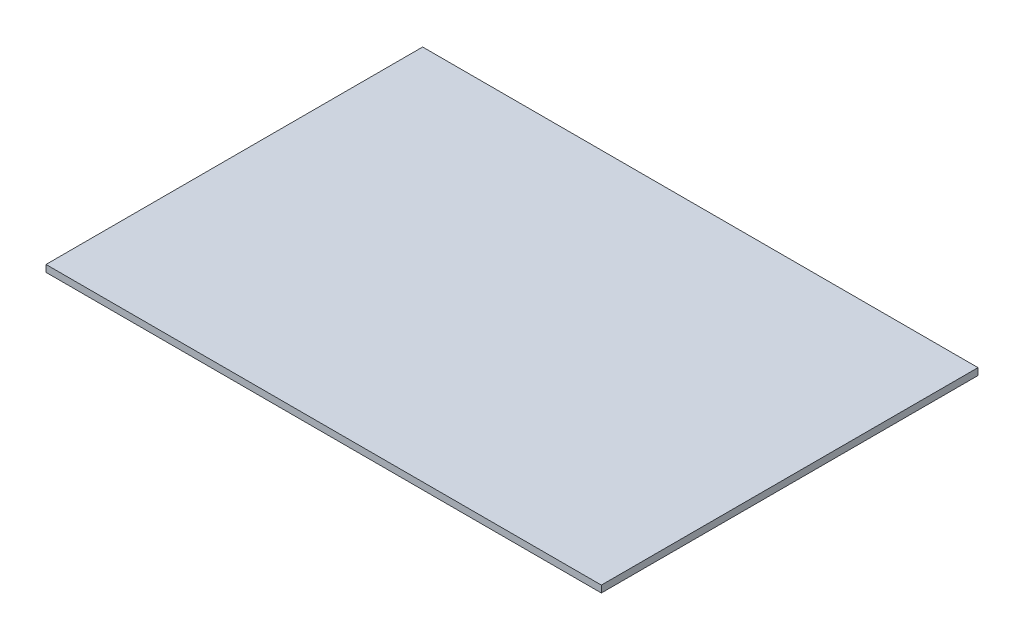
ISO-10303-21;
HEADER;
FILE_DESCRIPTION(('STEP AP214'),'2;1');
FILE_NAME('part.step','',(''),(''),'','','');
FILE_SCHEMA(('AUTOMOTIVE_DESIGN { 1 0 10303 214 1 1 1 1 }'));
ENDSEC;
DATA;
#1=APPLICATION_CONTEXT('core data for automotive mechanical design processes');
#2=APPLICATION_PROTOCOL_DEFINITION('international standard','automotive_design',2000,#1);
#3=PRODUCT_CONTEXT('',#1,'mechanical');
#4=PRODUCT('Part','Part','',(#3));
#5=PRODUCT_RELATED_PRODUCT_CATEGORY('part','',(#4));
#6=PRODUCT_DEFINITION_FORMATION('','',#4);
#7=PRODUCT_DEFINITION_CONTEXT('part definition',#1,'design');
#8=PRODUCT_DEFINITION('design','',#6,#7);
#9=PRODUCT_DEFINITION_SHAPE('','',#8);
#10=(LENGTH_UNIT() NAMED_UNIT(*) SI_UNIT(.MILLI.,.METRE.));
#11=(NAMED_UNIT(*) PLANE_ANGLE_UNIT() SI_UNIT($,.RADIAN.));
#12=(NAMED_UNIT(*) SI_UNIT($,.STERADIAN.) SOLID_ANGLE_UNIT());
#13=UNCERTAINTY_MEASURE_WITH_UNIT(LENGTH_MEASURE(1.E-05),#10,'distance_accuracy_value','');
#14=(GEOMETRIC_REPRESENTATION_CONTEXT(3) GLOBAL_UNCERTAINTY_ASSIGNED_CONTEXT((#13)) GLOBAL_UNIT_ASSIGNED_CONTEXT((#10,
#11,#12)) REPRESENTATION_CONTEXT('',''));
#15=CARTESIAN_POINT('',(0.,0.,0.));
#16=DIRECTION('',(0.,0.,1.));
#17=DIRECTION('',(1.,0.,0.));
#18=AXIS2_PLACEMENT_3D('',#15,#16,#17);
#19=CARTESIAN_POINT('',(102.580798220228,2.54,69.5721255256004));
#20=DIRECTION('',(-1.,0.,0.));
#21=DIRECTION('',(0.,0.,1.));
#22=AXIS2_PLACEMENT_3D('',#19,#20,#21);
#23=PLANE('',#22);
#24=DIRECTION('',(0.,0.,-1.));
#25=VECTOR('',#24,1.);
#26=CARTESIAN_POINT('',(102.580798220228,0.,69.5721255256004));
#27=LINE('',#26,#25);
#28=CARTESIAN_POINT('',(102.580798220228,0.,69.5721255256004));
#29=VERTEX_POINT('',#28);
#30=CARTESIAN_POINT('',(102.580798220228,0.,-69.5721255256004));
#31=VERTEX_POINT('',#30);
#32=EDGE_CURVE('E97',#29,#31,#27,.T.);
#33=ORIENTED_EDGE('',*,*,#32,.T.);
#34=DIRECTION('',(0.,-1.,0.));
#35=VECTOR('',#34,1.);
#36=CARTESIAN_POINT('',(102.580798220228,2.54,-69.5721255256004));
#37=LINE('',#36,#35);
#38=CARTESIAN_POINT('',(102.580798220228,2.54,-69.5721255256004));
#39=VERTEX_POINT('',#38);
#40=EDGE_CURVE('E11',#39,#31,#37,.T.);
#41=ORIENTED_EDGE('',*,*,#40,.F.);
#42=DIRECTION('',(0.,0.,-1.));
#43=VECTOR('',#42,1.);
#44=CARTESIAN_POINT('',(102.580798220228,2.54,69.5721255256004));
#45=LINE('',#44,#43);
#46=CARTESIAN_POINT('',(102.580798220228,2.54,69.5721255256004));
#47=VERTEX_POINT('',#46);
#48=EDGE_CURVE('E85',#47,#39,#45,.T.);
#49=ORIENTED_EDGE('',*,*,#48,.F.);
#50=DIRECTION('',(0.,-1.,0.));
#51=VECTOR('',#50,1.);
#52=CARTESIAN_POINT('',(102.580798220228,2.54,69.5721255256004));
#53=LINE('',#52,#51);
#54=EDGE_CURVE('E93',#47,#29,#53,.T.);
#55=ORIENTED_EDGE('',*,*,#54,.T.);
#56=EDGE_LOOP('',(#33,#41,#49,#55));
#57=FACE_BOUND('',#56,.T.);
#58=ADVANCED_FACE('F34',(#57),#23,.F.);
#59=CARTESIAN_POINT('',(-102.580798220228,2.54,-69.5721255256004));
#60=DIRECTION('',(0.,0.,1.));
#61=DIRECTION('',(1.,0.,0.));
#62=AXIS2_PLACEMENT_3D('',#59,#60,#61);
#63=PLANE('',#62);
#64=DIRECTION('',(-1.,0.,0.));
#65=VECTOR('',#64,1.);
#66=CARTESIAN_POINT('',(-102.580798220228,0.,-69.5721255256004));
#67=LINE('',#66,#65);
#68=CARTESIAN_POINT('',(-102.580798220228,0.,-69.5721255256004));
#69=VERTEX_POINT('',#68);
#70=EDGE_CURVE('E89',#31,#69,#67,.T.);
#71=ORIENTED_EDGE('',*,*,#70,.T.);
#72=DIRECTION('',(0.,-1.,0.));
#73=VECTOR('',#72,1.);
#74=CARTESIAN_POINT('',(-102.580798220228,2.54,-69.5721255256004));
#75=LINE('',#74,#73);
#76=CARTESIAN_POINT('',(-102.580798220228,2.54,-69.5721255256004));
#77=VERTEX_POINT('',#76);
#78=EDGE_CURVE('E42',#77,#69,#75,.T.);
#79=ORIENTED_EDGE('',*,*,#78,.F.);
#80=DIRECTION('',(-1.,0.,0.));
#81=VECTOR('',#80,1.);
#82=CARTESIAN_POINT('',(-102.580798220228,2.54,-69.5721255256004));
#83=LINE('',#82,#81);
#84=EDGE_CURVE('E80',#39,#77,#83,.T.);
#85=ORIENTED_EDGE('',*,*,#84,.F.);
#86=ORIENTED_EDGE('',*,*,#40,.T.);
#87=EDGE_LOOP('',(#71,#79,#85,#86));
#88=FACE_BOUND('',#87,.T.);
#89=ADVANCED_FACE('F88',(#88),#63,.F.);
#90=CARTESIAN_POINT('',(-102.580798220228,2.54,69.5721255256004));
#91=DIRECTION('',(1.,0.,0.));
#92=DIRECTION('',(0.,0.,-1.));
#93=AXIS2_PLACEMENT_3D('',#90,#91,#92);
#94=PLANE('',#93);
#95=DIRECTION('',(0.,0.,1.));
#96=VECTOR('',#95,1.);
#97=CARTESIAN_POINT('',(-102.580798220228,0.,69.5721255256004));
#98=LINE('',#97,#96);
#99=CARTESIAN_POINT('',(-102.580798220228,0.,69.5721255256004));
#100=VERTEX_POINT('',#99);
#101=EDGE_CURVE('E67',#69,#100,#98,.T.);
#102=ORIENTED_EDGE('',*,*,#101,.T.);
#103=DIRECTION('',(0.,-1.,0.));
#104=VECTOR('',#103,1.);
#105=CARTESIAN_POINT('',(-102.580798220228,2.54,69.5721255256004));
#106=LINE('',#105,#104);
#107=CARTESIAN_POINT('',(-102.580798220228,2.54,69.5721255256004));
#108=VERTEX_POINT('',#107);
#109=EDGE_CURVE('E90',#108,#100,#106,.T.);
#110=ORIENTED_EDGE('',*,*,#109,.F.);
#111=DIRECTION('',(0.,0.,1.));
#112=VECTOR('',#111,1.);
#113=CARTESIAN_POINT('',(-102.580798220228,2.54,69.5721255256004));
#114=LINE('',#113,#112);
#115=EDGE_CURVE('E83',#77,#108,#114,.T.);
#116=ORIENTED_EDGE('',*,*,#115,.F.);
#117=ORIENTED_EDGE('',*,*,#78,.T.);
#118=EDGE_LOOP('',(#102,#110,#116,#117));
#119=FACE_BOUND('',#118,.T.);
#120=ADVANCED_FACE('F91',(#119),#94,.F.);
#121=CARTESIAN_POINT('',(-102.580798220228,2.54,69.5721255256004));
#122=DIRECTION('',(0.,0.,-1.));
#123=DIRECTION('',(-1.,0.,0.));
#124=AXIS2_PLACEMENT_3D('',#121,#122,#123);
#125=PLANE('',#124);
#126=DIRECTION('',(1.,0.,0.));
#127=VECTOR('',#126,1.);
#128=CARTESIAN_POINT('',(-102.580798220228,0.,69.5721255256004));
#129=LINE('',#128,#127);
#130=EDGE_CURVE('E73',#100,#29,#129,.T.);
#131=ORIENTED_EDGE('',*,*,#130,.T.);
#132=ORIENTED_EDGE('',*,*,#54,.F.);
#133=DIRECTION('',(1.,0.,0.));
#134=VECTOR('',#133,1.);
#135=CARTESIAN_POINT('',(-102.580798220228,2.54,69.5721255256004));
#136=LINE('',#135,#134);
#137=EDGE_CURVE('E50',#108,#47,#136,.T.);
#138=ORIENTED_EDGE('',*,*,#137,.F.);
#139=ORIENTED_EDGE('',*,*,#109,.T.);
#140=EDGE_LOOP('',(#131,#132,#138,#139));
#141=FACE_BOUND('',#140,.T.);
#142=ADVANCED_FACE('F104',(#141),#125,.F.);
#143=CARTESIAN_POINT('',(0.,2.54,0.));
#144=DIRECTION('',(0.,-1.,0.));
#145=DIRECTION('',(0.,0.,-1.));
#146=AXIS2_PLACEMENT_3D('',#143,#144,#145);
#147=PLANE('',#146);
#148=ORIENTED_EDGE('',*,*,#48,.T.);
#149=ORIENTED_EDGE('',*,*,#84,.T.);
#150=ORIENTED_EDGE('',*,*,#115,.T.);
#151=ORIENTED_EDGE('',*,*,#137,.T.);
#152=EDGE_LOOP('',(#148,#149,#150,#151));
#153=FACE_BOUND('',#152,.T.);
#154=ADVANCED_FACE('F81',(#153),#147,.F.);
#155=CARTESIAN_POINT('',(0.,0.,0.));
#156=DIRECTION('',(0.,-1.,0.));
#157=DIRECTION('',(0.,0.,-1.));
#158=AXIS2_PLACEMENT_3D('',#155,#156,#157);
#159=PLANE('',#158);
#160=ORIENTED_EDGE('',*,*,#32,.F.);
#161=ORIENTED_EDGE('',*,*,#130,.F.);
#162=ORIENTED_EDGE('',*,*,#101,.F.);
#163=ORIENTED_EDGE('',*,*,#70,.F.);
#164=EDGE_LOOP('',(#160,#161,#162,#163));
#165=FACE_BOUND('',#164,.T.);
#166=ADVANCED_FACE('F107',(#165),#159,.T.);
#167=CLOSED_SHELL('',(#58,#89,#120,#142,#154,#166));
#168=MANIFOLD_SOLID_BREP('B2',#167);
#169=ADVANCED_BREP_SHAPE_REPRESENTATION('',(#18,#168),#14);
#170=SHAPE_DEFINITION_REPRESENTATION(#9,#169);
ENDSEC;
END-ISO-10303-21;
